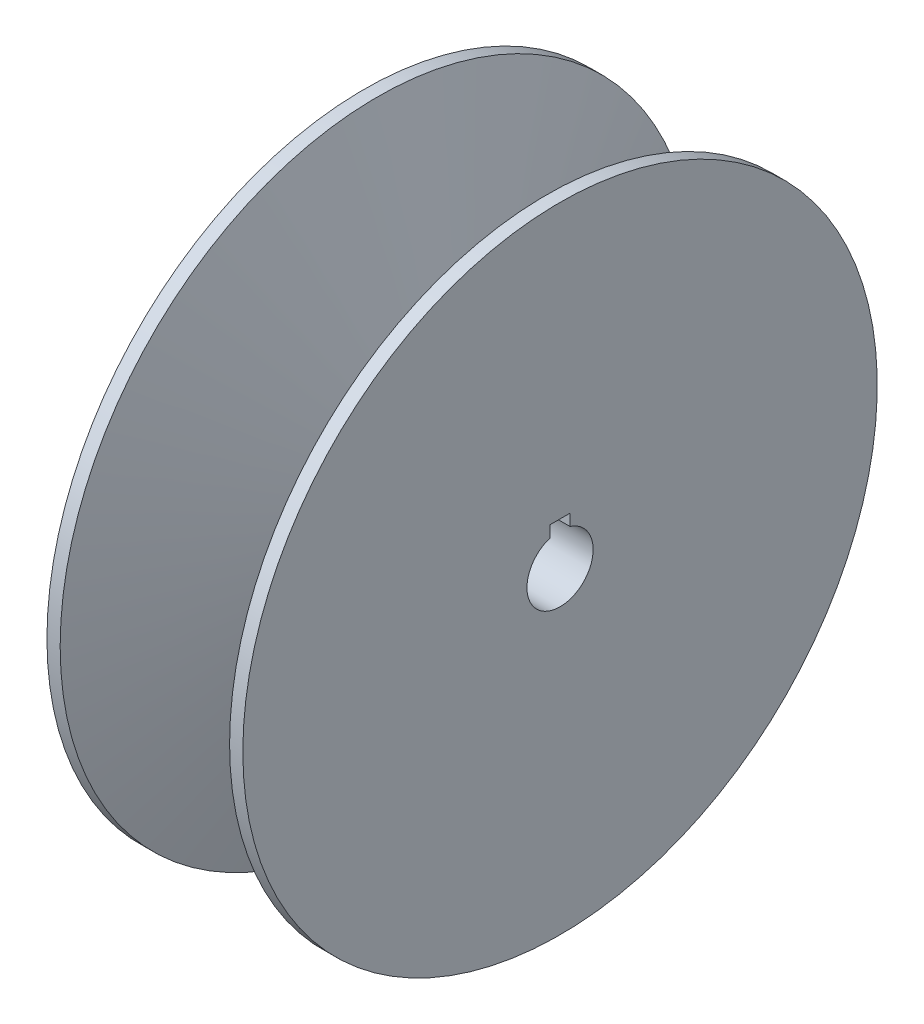
ISO-10303-21;
HEADER;
FILE_DESCRIPTION(('STEP AP214'),'2;1');
FILE_NAME('part.step','',(''),(''),'','','');
FILE_SCHEMA(('AUTOMOTIVE_DESIGN { 1 0 10303 214 1 1 1 1 }'));
ENDSEC;
DATA;
#1=APPLICATION_CONTEXT('core data for automotive mechanical design processes');
#2=APPLICATION_PROTOCOL_DEFINITION('international standard','automotive_design',2000,#1);
#3=PRODUCT_CONTEXT('',#1,'mechanical');
#4=PRODUCT('Part','Part','',(#3));
#5=PRODUCT_RELATED_PRODUCT_CATEGORY('part','',(#4));
#6=PRODUCT_DEFINITION_FORMATION('','',#4);
#7=PRODUCT_DEFINITION_CONTEXT('part definition',#1,'design');
#8=PRODUCT_DEFINITION('design','',#6,#7);
#9=PRODUCT_DEFINITION_SHAPE('','',#8);
#10=(LENGTH_UNIT() NAMED_UNIT(*) SI_UNIT(.MILLI.,.METRE.));
#11=(NAMED_UNIT(*) PLANE_ANGLE_UNIT() SI_UNIT($,.RADIAN.));
#12=(NAMED_UNIT(*) SI_UNIT($,.STERADIAN.) SOLID_ANGLE_UNIT());
#13=UNCERTAINTY_MEASURE_WITH_UNIT(LENGTH_MEASURE(1.E-05),#10,'distance_accuracy_value','');
#14=(GEOMETRIC_REPRESENTATION_CONTEXT(3) GLOBAL_UNCERTAINTY_ASSIGNED_CONTEXT((#13)) GLOBAL_UNIT_ASSIGNED_CONTEXT((#10,
#11,#12)) REPRESENTATION_CONTEXT('',''));
#15=CARTESIAN_POINT('',(0.,0.,0.));
#16=DIRECTION('',(0.,0.,1.));
#17=DIRECTION('',(1.,0.,0.));
#18=AXIS2_PLACEMENT_3D('',#15,#16,#17);
#19=CARTESIAN_POINT('',(43.815,0.,0.));
#20=DIRECTION('',(1.,0.,0.));
#21=DIRECTION('',(0.,0.,-1.));
#22=AXIS2_PLACEMENT_3D('',#19,#20,#21);
#23=PLANE('',#22);
#24=CARTESIAN_POINT('',(43.815,0.,0.));
#25=DIRECTION('',(-1.,0.,0.));
#26=DIRECTION('',(0.,0.,1.));
#27=AXIS2_PLACEMENT_3D('',#24,#25,#26);
#28=CIRCLE('',#27,76.09205);
#29=CARTESIAN_POINT('',(43.815,0.,76.09205));
#30=VERTEX_POINT('',#29);
#31=EDGE_CURVE('E76',#30,#30,#28,.T.);
#32=ORIENTED_EDGE('',*,*,#31,.F.);
#33=EDGE_LOOP('',(#32));
#34=FACE_BOUND('',#33,.T.);
#35=DIRECTION('',(0.,-1.,0.));
#36=VECTOR('',#35,1.);
#37=CARTESIAN_POINT('',(43.815,0.,-2.38125));
#38=LINE('',#37,#36);
#39=CARTESIAN_POINT('',(43.815,10.31875,-2.38125));
#40=VERTEX_POINT('',#39);
#41=CARTESIAN_POINT('',(43.815,7.57189241124701,-2.38125));
#42=VERTEX_POINT('',#41);
#43=EDGE_CURVE('E111',#40,#42,#38,.T.);
#44=ORIENTED_EDGE('',*,*,#43,.T.);
#45=CARTESIAN_POINT('',(43.815,0.,0.));
#46=DIRECTION('',(1.,0.,0.));
#47=DIRECTION('',(0.,0.,-1.));
#48=AXIS2_PLACEMENT_3D('',#45,#46,#47);
#49=CIRCLE('',#48,7.9375);
#50=CARTESIAN_POINT('',(43.815,7.57189241124701,2.38125));
#51=VERTEX_POINT('',#50);
#52=EDGE_CURVE('E108',#42,#51,#49,.F.);
#53=ORIENTED_EDGE('',*,*,#52,.T.);
#54=DIRECTION('',(0.,-1.,0.));
#55=VECTOR('',#54,1.);
#56=CARTESIAN_POINT('',(43.815,0.,2.38125));
#57=LINE('',#56,#55);
#58=CARTESIAN_POINT('',(43.815,10.31875,2.38125));
#59=VERTEX_POINT('',#58);
#60=EDGE_CURVE('E115',#59,#51,#57,.T.);
#61=ORIENTED_EDGE('',*,*,#60,.F.);
#62=DIRECTION('',(0.,0.,-1.));
#63=VECTOR('',#62,1.);
#64=CARTESIAN_POINT('',(43.815,10.31875,0.));
#65=LINE('',#64,#63);
#66=EDGE_CURVE('E83',#59,#40,#65,.T.);
#67=ORIENTED_EDGE('',*,*,#66,.T.);
#68=EDGE_LOOP('',(#44,#53,#61,#67));
#69=FACE_BOUND('',#68,.T.);
#70=ADVANCED_FACE('F34',(#34,#69),#23,.T.);
#71=CARTESIAN_POINT('',(-3.175,0.,0.));
#72=DIRECTION('',(1.,0.,0.));
#73=DIRECTION('',(0.,0.,-1.));
#74=AXIS2_PLACEMENT_3D('',#71,#72,#73);
#75=PLANE('',#74);
#76=CARTESIAN_POINT('',(-3.17500000000001,0.,0.));
#77=DIRECTION('',(-1.,0.,0.));
#78=DIRECTION('',(0.,0.,1.));
#79=AXIS2_PLACEMENT_3D('',#76,#77,#78);
#80=CIRCLE('',#79,76.09205);
#81=CARTESIAN_POINT('',(-3.17500000000001,0.,76.09205));
#82=VERTEX_POINT('',#81);
#83=EDGE_CURVE('E105',#82,#82,#80,.T.);
#84=ORIENTED_EDGE('',*,*,#83,.T.);
#85=EDGE_LOOP('',(#84));
#86=FACE_BOUND('',#85,.T.);
#87=CARTESIAN_POINT('',(-3.175,0.,0.));
#88=DIRECTION('',(1.,0.,0.));
#89=DIRECTION('',(0.,0.,-1.));
#90=AXIS2_PLACEMENT_3D('',#87,#88,#89);
#91=CIRCLE('',#90,7.9375);
#92=CARTESIAN_POINT('',(-3.175,7.57189241124701,-2.38125));
#93=VERTEX_POINT('',#92);
#94=CARTESIAN_POINT('',(-3.175,7.57189241124701,2.38125));
#95=VERTEX_POINT('',#94);
#96=EDGE_CURVE('E11',#93,#95,#91,.F.);
#97=ORIENTED_EDGE('',*,*,#96,.F.);
#98=DIRECTION('',(0.,-1.,0.));
#99=VECTOR('',#98,1.);
#100=CARTESIAN_POINT('',(-3.175,0.,-2.38125));
#101=LINE('',#100,#99);
#102=CARTESIAN_POINT('',(-3.175,10.31875,-2.38125));
#103=VERTEX_POINT('',#102);
#104=EDGE_CURVE('E41',#103,#93,#101,.T.);
#105=ORIENTED_EDGE('',*,*,#104,.F.);
#106=DIRECTION('',(0.,0.,-1.));
#107=VECTOR('',#106,1.);
#108=CARTESIAN_POINT('',(-3.175,10.31875,0.));
#109=LINE('',#108,#107);
#110=CARTESIAN_POINT('',(-3.175,10.31875,2.38125));
#111=VERTEX_POINT('',#110);
#112=EDGE_CURVE('E75',#111,#103,#109,.T.);
#113=ORIENTED_EDGE('',*,*,#112,.F.);
#114=DIRECTION('',(0.,-1.,0.));
#115=VECTOR('',#114,1.);
#116=CARTESIAN_POINT('',(-3.175,0.,2.38125));
#117=LINE('',#116,#115);
#118=EDGE_CURVE('E70',#111,#95,#117,.T.);
#119=ORIENTED_EDGE('',*,*,#118,.T.);
#120=EDGE_LOOP('',(#97,#105,#113,#119));
#121=FACE_BOUND('',#120,.T.);
#122=ADVANCED_FACE('F88',(#86,#121),#75,.F.);
#123=CARTESIAN_POINT('',(0.,0.,0.));
#124=DIRECTION('',(-1.,0.,0.));
#125=DIRECTION('',(0.,0.,1.));
#126=AXIS2_PLACEMENT_3D('',#123,#124,#125);
#127=CYLINDRICAL_SURFACE('',#126,76.09205);
#128=ORIENTED_EDGE('',*,*,#31,.T.);
#129=EDGE_LOOP('',(#128));
#130=FACE_BOUND('',#129,.T.);
#131=CARTESIAN_POINT('',(40.64,0.,0.));
#132=DIRECTION('',(-1.,0.,0.));
#133=DIRECTION('',(0.,0.,1.));
#134=AXIS2_PLACEMENT_3D('',#131,#132,#133);
#135=CIRCLE('',#134,76.09205);
#136=CARTESIAN_POINT('',(40.64,0.,76.09205));
#137=VERTEX_POINT('',#136);
#138=EDGE_CURVE('E93',#137,#137,#135,.T.);
#139=ORIENTED_EDGE('',*,*,#138,.F.);
#140=EDGE_LOOP('',(#139));
#141=FACE_BOUND('',#140,.T.);
#142=ADVANCED_FACE('F144',(#130,#141),#127,.T.);
#143=CARTESIAN_POINT('',(40.64,0.,0.));
#144=DIRECTION('',(1.,0.,0.));
#145=DIRECTION('',(0.,0.,-1.));
#146=AXIS2_PLACEMENT_3D('',#143,#144,#145);
#147=CONICAL_SURFACE('',#146,76.09205,1.28500702817278);
#148=CARTESIAN_POINT('',(27.4015465377544,0.,0.));
#149=DIRECTION('',(-1.,0.,0.));
#150=DIRECTION('',(0.,0.,1.));
#151=AXIS2_PLACEMENT_3D('',#148,#149,#150);
#152=CIRCLE('',#151,31.0376815067281);
#153=CARTESIAN_POINT('',(27.4015465377544,0.,31.0376815067281));
#154=VERTEX_POINT('',#153);
#155=EDGE_CURVE('E96',#154,#154,#152,.T.);
#156=ORIENTED_EDGE('',*,*,#155,.F.);
#157=EDGE_LOOP('',(#156));
#158=FACE_BOUND('',#157,.T.);
#159=ORIENTED_EDGE('',*,*,#138,.T.);
#160=EDGE_LOOP('',(#159));
#161=FACE_BOUND('',#160,.T.);
#162=ADVANCED_FACE('F150',(#158,#161),#147,.T.);
#163=CARTESIAN_POINT('',(0.,0.,0.));
#164=DIRECTION('',(-1.,0.,0.));
#165=DIRECTION('',(0.,0.,1.));
#166=AXIS2_PLACEMENT_3D('',#163,#164,#165);
#167=CYLINDRICAL_SURFACE('',#166,31.0376815067281);
#168=ORIENTED_EDGE('',*,*,#155,.T.);
#169=EDGE_LOOP('',(#168));
#170=FACE_BOUND('',#169,.T.);
#171=CARTESIAN_POINT('',(13.2384534622456,0.,0.));
#172=DIRECTION('',(-1.,0.,0.));
#173=DIRECTION('',(0.,0.,1.));
#174=AXIS2_PLACEMENT_3D('',#171,#172,#173);
#175=CIRCLE('',#174,31.0376815067281);
#176=CARTESIAN_POINT('',(13.2384534622456,0.,31.0376815067281));
#177=VERTEX_POINT('',#176);
#178=EDGE_CURVE('E99',#177,#177,#175,.T.);
#179=ORIENTED_EDGE('',*,*,#178,.F.);
#180=EDGE_LOOP('',(#179));
#181=FACE_BOUND('',#180,.T.);
#182=ADVANCED_FACE('F154',(#170,#181),#167,.T.);
#183=CARTESIAN_POINT('',(0.,0.,0.));
#184=DIRECTION('',(-1.,0.,0.));
#185=DIRECTION('',(0.,0.,1.));
#186=AXIS2_PLACEMENT_3D('',#183,#184,#185);
#187=CONICAL_SURFACE('',#186,76.09205,1.28500702817278);
#188=ORIENTED_EDGE('',*,*,#178,.T.);
#189=EDGE_LOOP('',(#188));
#190=FACE_BOUND('',#189,.T.);
#191=CARTESIAN_POINT('',(0.,0.,0.));
#192=DIRECTION('',(-1.,0.,0.));
#193=DIRECTION('',(0.,0.,1.));
#194=AXIS2_PLACEMENT_3D('',#191,#192,#193);
#195=CIRCLE('',#194,76.09205);
#196=CARTESIAN_POINT('',(0.,0.,76.09205));
#197=VERTEX_POINT('',#196);
#198=EDGE_CURVE('E102',#197,#197,#195,.T.);
#199=ORIENTED_EDGE('',*,*,#198,.F.);
#200=EDGE_LOOP('',(#199));
#201=FACE_BOUND('',#200,.T.);
#202=ADVANCED_FACE('F135',(#190,#201),#187,.T.);
#203=CARTESIAN_POINT('',(0.,0.,0.));
#204=DIRECTION('',(-1.,0.,0.));
#205=DIRECTION('',(0.,0.,1.));
#206=AXIS2_PLACEMENT_3D('',#203,#204,#205);
#207=CYLINDRICAL_SURFACE('',#206,76.09205);
#208=ORIENTED_EDGE('',*,*,#83,.F.);
#209=EDGE_LOOP('',(#208));
#210=FACE_BOUND('',#209,.T.);
#211=ORIENTED_EDGE('',*,*,#198,.T.);
#212=EDGE_LOOP('',(#211));
#213=FACE_BOUND('',#212,.T.);
#214=ADVANCED_FACE('F128',(#210,#213),#207,.T.);
#215=CARTESIAN_POINT('',(68.961,0.,0.));
#216=DIRECTION('',(-1.,0.,0.));
#217=DIRECTION('',(0.,0.,1.));
#218=AXIS2_PLACEMENT_3D('',#215,#216,#217);
#219=CYLINDRICAL_SURFACE('',#218,7.9375);
#220=DIRECTION('',(-1.,0.,0.));
#221=VECTOR('',#220,1.);
#222=CARTESIAN_POINT('',(68.961,7.57189241124701,-2.38125));
#223=LINE('',#222,#221);
#224=EDGE_CURVE('E117',#42,#93,#223,.T.);
#225=ORIENTED_EDGE('',*,*,#224,.T.);
#226=ORIENTED_EDGE('',*,*,#96,.T.);
#227=DIRECTION('',(-1.,0.,0.));
#228=VECTOR('',#227,1.);
#229=CARTESIAN_POINT('',(68.961,7.57189241124701,2.38125));
#230=LINE('',#229,#228);
#231=EDGE_CURVE('E53',#51,#95,#230,.T.);
#232=ORIENTED_EDGE('',*,*,#231,.F.);
#233=ORIENTED_EDGE('',*,*,#52,.F.);
#234=EDGE_LOOP('',(#225,#226,#232,#233));
#235=FACE_BOUND('',#234,.T.);
#236=ADVANCED_FACE('F126',(#235),#219,.F.);
#237=CARTESIAN_POINT('',(68.961,0.,-2.38125));
#238=DIRECTION('',(0.,0.,1.));
#239=DIRECTION('',(1.,0.,0.));
#240=AXIS2_PLACEMENT_3D('',#237,#238,#239);
#241=PLANE('',#240);
#242=DIRECTION('',(-1.,0.,0.));
#243=VECTOR('',#242,1.);
#244=CARTESIAN_POINT('',(68.961,10.31875,-2.38125));
#245=LINE('',#244,#243);
#246=EDGE_CURVE('E85',#40,#103,#245,.T.);
#247=ORIENTED_EDGE('',*,*,#246,.T.);
#248=ORIENTED_EDGE('',*,*,#104,.T.);
#249=ORIENTED_EDGE('',*,*,#224,.F.);
#250=ORIENTED_EDGE('',*,*,#43,.F.);
#251=EDGE_LOOP('',(#247,#248,#249,#250));
#252=FACE_BOUND('',#251,.T.);
#253=ADVANCED_FACE('F122',(#252),#241,.T.);
#254=CARTESIAN_POINT('',(68.961,10.31875,0.));
#255=DIRECTION('',(0.,-1.,0.));
#256=DIRECTION('',(0.,0.,-1.));
#257=AXIS2_PLACEMENT_3D('',#254,#255,#256);
#258=PLANE('',#257);
#259=DIRECTION('',(-1.,0.,0.));
#260=VECTOR('',#259,1.);
#261=CARTESIAN_POINT('',(68.961,10.31875,2.38125));
#262=LINE('',#261,#260);
#263=EDGE_CURVE('E48',#59,#111,#262,.T.);
#264=ORIENTED_EDGE('',*,*,#263,.T.);
#265=ORIENTED_EDGE('',*,*,#112,.T.);
#266=ORIENTED_EDGE('',*,*,#246,.F.);
#267=ORIENTED_EDGE('',*,*,#66,.F.);
#268=EDGE_LOOP('',(#264,#265,#266,#267));
#269=FACE_BOUND('',#268,.T.);
#270=ADVANCED_FACE('F79',(#269),#258,.T.);
#271=CARTESIAN_POINT('',(68.961,0.,2.38125));
#272=DIRECTION('',(0.,0.,1.));
#273=DIRECTION('',(1.,0.,0.));
#274=AXIS2_PLACEMENT_3D('',#271,#272,#273);
#275=PLANE('',#274);
#276=ORIENTED_EDGE('',*,*,#60,.T.);
#277=ORIENTED_EDGE('',*,*,#231,.T.);
#278=ORIENTED_EDGE('',*,*,#118,.F.);
#279=ORIENTED_EDGE('',*,*,#263,.F.);
#280=EDGE_LOOP('',(#276,#277,#278,#279));
#281=FACE_BOUND('',#280,.T.);
#282=ADVANCED_FACE('F71',(#281),#275,.F.);
#283=CLOSED_SHELL('',(#70,#122,#142,#162,#182,#202,#214,#236,#253,#270,#282));
#284=MANIFOLD_SOLID_BREP('B2',#283);
#285=ADVANCED_BREP_SHAPE_REPRESENTATION('',(#18,#284),#14);
#286=SHAPE_DEFINITION_REPRESENTATION(#9,#285);
ENDSEC;
END-ISO-10303-21;
